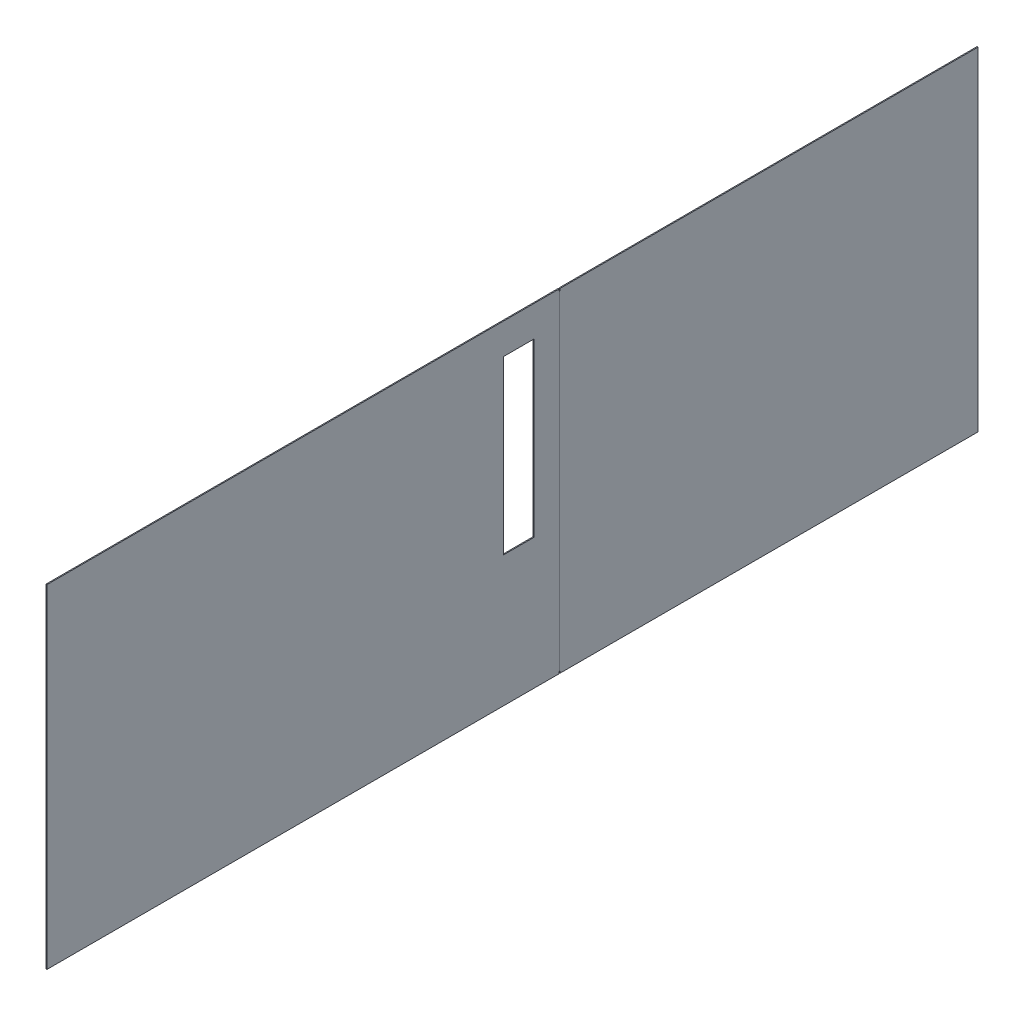
ISO-10303-21;
HEADER;
FILE_DESCRIPTION(('STEP AP214'),'2;1');
FILE_NAME('part.step','',(''),(''),'','','');
FILE_SCHEMA(('AUTOMOTIVE_DESIGN { 1 0 10303 214 1 1 1 1 }'));
ENDSEC;
DATA;
#1=APPLICATION_CONTEXT('core data for automotive mechanical design processes');
#2=APPLICATION_PROTOCOL_DEFINITION('international standard','automotive_design',2000,#1);
#3=PRODUCT_CONTEXT('',#1,'mechanical');
#4=PRODUCT('Part','Part','',(#3));
#5=PRODUCT_RELATED_PRODUCT_CATEGORY('part','',(#4));
#6=PRODUCT_DEFINITION_FORMATION('','',#4);
#7=PRODUCT_DEFINITION_CONTEXT('part definition',#1,'design');
#8=PRODUCT_DEFINITION('design','',#6,#7);
#9=PRODUCT_DEFINITION_SHAPE('','',#8);
#10=(LENGTH_UNIT() NAMED_UNIT(*) SI_UNIT(.MILLI.,.METRE.));
#11=(NAMED_UNIT(*) PLANE_ANGLE_UNIT() SI_UNIT($,.RADIAN.));
#12=(NAMED_UNIT(*) SI_UNIT($,.STERADIAN.) SOLID_ANGLE_UNIT());
#13=UNCERTAINTY_MEASURE_WITH_UNIT(LENGTH_MEASURE(1.E-05),#10,'distance_accuracy_value','');
#14=(GEOMETRIC_REPRESENTATION_CONTEXT(3) GLOBAL_UNCERTAINTY_ASSIGNED_CONTEXT((#13)) GLOBAL_UNIT_ASSIGNED_CONTEXT((#10,
#11,#12)) REPRESENTATION_CONTEXT('',''));
#15=CARTESIAN_POINT('',(0.,0.,0.));
#16=DIRECTION('',(0.,0.,1.));
#17=DIRECTION('',(1.,0.,0.));
#18=AXIS2_PLACEMENT_3D('',#15,#16,#17);
#19=CARTESIAN_POINT('',(1.9,650.,0.117101314961448));
#20=DIRECTION('',(-1.,0.,0.));
#21=DIRECTION('',(0.,0.,1.));
#22=AXIS2_PLACEMENT_3D('',#19,#20,#21);
#23=PLANE('',#22);
#24=DIRECTION('',(0.,0.,-1.));
#25=VECTOR('',#24,1.);
#26=CARTESIAN_POINT('',(1.9,650.,0.117101314961448));
#27=LINE('',#26,#25);
#28=CARTESIAN_POINT('',(1.90000000000003,650.,-0.691449342519362));
#29=VERTEX_POINT('',#28);
#30=CARTESIAN_POINT('',(1.89999999999342,650.,-816.032394794667));
#31=VERTEX_POINT('',#30);
#32=EDGE_CURVE('E229',#29,#31,#27,.T.);
#33=ORIENTED_EDGE('',*,*,#32,.F.);
#34=DIRECTION('',(0.,-1.,0.));
#35=VECTOR('',#34,1.);
#36=CARTESIAN_POINT('',(1.90000000000003,0.,-0.69144934251949));
#37=LINE('',#36,#35);
#38=CARTESIAN_POINT('',(1.90000000000003,646.7,-0.691449342519363));
#39=VERTEX_POINT('',#38);
#40=EDGE_CURVE('E210',#29,#39,#37,.T.);
#41=ORIENTED_EDGE('',*,*,#40,.T.);
#42=CARTESIAN_POINT('',(1.90000000000003,646.7,0.00855065748047966));
#43=DIRECTION('',(-1.,0.,0.));
#44=DIRECTION('',(0.,0.,1.));
#45=AXIS2_PLACEMENT_3D('',#42,#43,#44);
#46=CIRCLE('',#45,0.699999999999883);
#47=CARTESIAN_POINT('',(1.90000000000003,646.002054129574,-0.0450362994651993));
#48=VERTEX_POINT('',#47);
#49=EDGE_CURVE('E220',#39,#48,#46,.T.);
#50=ORIENTED_EDGE('',*,*,#49,.T.);
#51=DIRECTION('',(0.,-1.,0.));
#52=VECTOR('',#51,1.);
#53=CARTESIAN_POINT('',(1.9,650.,-0.0450362994651925));
#54=LINE('',#53,#52);
#55=CARTESIAN_POINT('',(1.90000000000003,3.99794587042642,-0.0450362994651924));
#56=VERTEX_POINT('',#55);
#57=EDGE_CURVE('E383',#48,#56,#54,.T.);
#58=ORIENTED_EDGE('',*,*,#57,.T.);
#59=CARTESIAN_POINT('',(1.90000000000003,3.3,0.00855065748055846));
#60=DIRECTION('',(-1.,0.,0.));
#61=DIRECTION('',(0.,0.,1.));
#62=AXIS2_PLACEMENT_3D('',#59,#60,#61);
#63=CIRCLE('',#62,0.7);
#64=CARTESIAN_POINT('',(1.90000000000003,3.3,-0.691449342519442));
#65=VERTEX_POINT('',#64);
#66=EDGE_CURVE('E262',#65,#56,#63,.F.);
#67=ORIENTED_EDGE('',*,*,#66,.F.);
#68=DIRECTION('',(0.,1.,0.));
#69=VECTOR('',#68,1.);
#70=CARTESIAN_POINT('',(1.90000000000003,0.,-0.691449342519442));
#71=LINE('',#70,#69);
#72=CARTESIAN_POINT('',(1.90000000000003,0.,-0.691449342519442));
#73=VERTEX_POINT('',#72);
#74=EDGE_CURVE('E264',#73,#65,#71,.T.);
#75=ORIENTED_EDGE('',*,*,#74,.F.);
#76=DIRECTION('',(0.,0.,-1.));
#77=VECTOR('',#76,1.);
#78=CARTESIAN_POINT('',(1.9,0.,0.117101314961448));
#79=LINE('',#78,#77);
#80=CARTESIAN_POINT('',(1.89999999999342,0.,-816.032394794667));
#81=VERTEX_POINT('',#80);
#82=EDGE_CURVE('E305',#73,#81,#79,.T.);
#83=ORIENTED_EDGE('',*,*,#82,.T.);
#84=DIRECTION('',(0.,-1.,0.));
#85=VECTOR('',#84,1.);
#86=CARTESIAN_POINT('',(1.89999999999342,650.,-816.032394794667));
#87=LINE('',#86,#85);
#88=EDGE_CURVE('E377',#31,#81,#87,.T.);
#89=ORIENTED_EDGE('',*,*,#88,.F.);
#90=EDGE_LOOP('',(#33,#41,#50,#58,#67,#75,#83,#89));
#91=FACE_BOUND('',#90,.T.);
#92=ADVANCED_FACE('F45',(#91),#23,.F.);
#93=CARTESIAN_POINT('',(0.,650.,0.117101314961463));
#94=DIRECTION('',(-1.,0.,0.));
#95=DIRECTION('',(0.,0.,1.));
#96=AXIS2_PLACEMENT_3D('',#93,#94,#95);
#97=PLANE('',#96);
#98=DIRECTION('',(0.,-1.,0.));
#99=VECTOR('',#98,1.);
#100=CARTESIAN_POINT('',(0.,0.,-0.69144934251949));
#101=LINE('',#100,#99);
#102=CARTESIAN_POINT('',(0.,650.,-0.691449342519362));
#103=VERTEX_POINT('',#102);
#104=CARTESIAN_POINT('',(0.,646.7,-0.691449342519363));
#105=VERTEX_POINT('',#104);
#106=EDGE_CURVE('E213',#103,#105,#101,.T.);
#107=ORIENTED_EDGE('',*,*,#106,.F.);
#108=DIRECTION('',(0.,0.,-1.));
#109=VECTOR('',#108,1.);
#110=CARTESIAN_POINT('',(0.,650.,0.117101314961463));
#111=LINE('',#110,#109);
#112=CARTESIAN_POINT('',(-6.57676360203349E-12,650.,-816.032394794667));
#113=VERTEX_POINT('',#112);
#114=EDGE_CURVE('E367',#103,#113,#111,.T.);
#115=ORIENTED_EDGE('',*,*,#114,.T.);
#116=DIRECTION('',(0.,-1.,0.));
#117=VECTOR('',#116,1.);
#118=CARTESIAN_POINT('',(-6.57676360203349E-12,650.,-816.032394794667));
#119=LINE('',#118,#117);
#120=CARTESIAN_POINT('',(-6.57676360203349E-12,0.,-816.032394794667));
#121=VERTEX_POINT('',#120);
#122=EDGE_CURVE('E369',#113,#121,#119,.T.);
#123=ORIENTED_EDGE('',*,*,#122,.T.);
#124=DIRECTION('',(0.,0.,-1.));
#125=VECTOR('',#124,1.);
#126=CARTESIAN_POINT('',(0.,0.,0.117101314961463));
#127=LINE('',#126,#125);
#128=CARTESIAN_POINT('',(0.,0.,-0.691449342519442));
#129=VERTEX_POINT('',#128);
#130=EDGE_CURVE('E364',#129,#121,#127,.T.);
#131=ORIENTED_EDGE('',*,*,#130,.F.);
#132=DIRECTION('',(0.,1.,0.));
#133=VECTOR('',#132,1.);
#134=CARTESIAN_POINT('',(0.,0.,-0.691449342519442));
#135=LINE('',#134,#133);
#136=CARTESIAN_POINT('',(0.,3.3,-0.691449342519442));
#137=VERTEX_POINT('',#136);
#138=EDGE_CURVE('E279',#129,#137,#135,.T.);
#139=ORIENTED_EDGE('',*,*,#138,.T.);
#140=CARTESIAN_POINT('',(0.,3.3,0.00855065748055846));
#141=DIRECTION('',(-1.,0.,0.));
#142=DIRECTION('',(0.,0.,1.));
#143=AXIS2_PLACEMENT_3D('',#140,#141,#142);
#144=CIRCLE('',#143,0.7);
#145=CARTESIAN_POINT('',(0.,3.99794587042642,-0.045036299465177));
#146=VERTEX_POINT('',#145);
#147=EDGE_CURVE('E276',#137,#146,#144,.F.);
#148=ORIENTED_EDGE('',*,*,#147,.T.);
#149=DIRECTION('',(0.,-1.,0.));
#150=VECTOR('',#149,1.);
#151=CARTESIAN_POINT('',(0.,650.,-0.045036299465177));
#152=LINE('',#151,#150);
#153=CARTESIAN_POINT('',(0.,646.002054129574,-0.045036299465184));
#154=VERTEX_POINT('',#153);
#155=EDGE_CURVE('E380',#154,#146,#152,.T.);
#156=ORIENTED_EDGE('',*,*,#155,.F.);
#157=CARTESIAN_POINT('',(0.,646.7,0.00855065748047966));
#158=DIRECTION('',(-1.,0.,0.));
#159=DIRECTION('',(0.,0.,1.));
#160=AXIS2_PLACEMENT_3D('',#157,#158,#159);
#161=CIRCLE('',#160,0.699999999999883);
#162=EDGE_CURVE('E243',#105,#154,#161,.T.);
#163=ORIENTED_EDGE('',*,*,#162,.F.);
#164=EDGE_LOOP('',(#107,#115,#123,#131,#139,#148,#156,#163));
#165=FACE_BOUND('',#164,.T.);
#166=ADVANCED_FACE('F408',(#165),#97,.T.);
#167=CARTESIAN_POINT('',(2.63659999999999,0.,-0.0450362994651984));
#168=DIRECTION('',(0.,1.,0.));
#169=DIRECTION('',(0.992465233221436,0.,-0.122526572002654));
#170=AXIS2_PLACEMENT_3D('',#167,#168,#169);
#171=PLANE('',#170);
#172=DIRECTION('',(-1.,0.,0.));
#173=VECTOR('',#172,1.);
#174=CARTESIAN_POINT('',(1.90000000000003,0.,-0.691449342519442));
#175=LINE('',#174,#173);
#176=EDGE_CURVE('E298',#73,#129,#175,.T.);
#177=ORIENTED_EDGE('',*,*,#176,.T.);
#178=ORIENTED_EDGE('',*,*,#130,.T.);
#179=DIRECTION('',(1.,0.,-1.61259894326804E-13));
#180=VECTOR('',#179,1.);
#181=CARTESIAN_POINT('',(-6.57676360203349E-12,0.,-816.032394794667));
#182=LINE('',#181,#180);
#183=EDGE_CURVE('E371',#121,#81,#182,.T.);
#184=ORIENTED_EDGE('',*,*,#183,.T.);
#185=ORIENTED_EDGE('',*,*,#82,.F.);
#186=EDGE_LOOP('',(#177,#178,#184,#185));
#187=FACE_BOUND('',#186,.T.);
#188=ADVANCED_FACE('F406',(#187),#171,.F.);
#189=CARTESIAN_POINT('',(0.,650.,1000.));
#190=DIRECTION('',(-1.,0.,0.));
#191=DIRECTION('',(0.,0.,1.));
#192=AXIS2_PLACEMENT_3D('',#189,#190,#191);
#193=PLANE('',#192);
#194=DIRECTION('',(0.,1.,0.));
#195=VECTOR('',#194,1.);
#196=CARTESIAN_POINT('',(0.,590.,110.));
#197=LINE('',#196,#195);
#198=CARTESIAN_POINT('',(0.,255.,110.));
#199=VERTEX_POINT('',#198);
#200=CARTESIAN_POINT('',(0.,590.,110.));
#201=VERTEX_POINT('',#200);
#202=EDGE_CURVE('E335',#199,#201,#197,.T.);
#203=ORIENTED_EDGE('',*,*,#202,.F.);
#204=DIRECTION('',(0.,0.,1.));
#205=VECTOR('',#204,1.);
#206=CARTESIAN_POINT('',(0.,255.,50.));
#207=LINE('',#206,#205);
#208=CARTESIAN_POINT('',(0.,255.,50.));
#209=VERTEX_POINT('',#208);
#210=EDGE_CURVE('E339',#209,#199,#207,.T.);
#211=ORIENTED_EDGE('',*,*,#210,.F.);
#212=DIRECTION('',(0.,-1.,0.));
#213=VECTOR('',#212,1.);
#214=CARTESIAN_POINT('',(0.,590.,50.));
#215=LINE('',#214,#213);
#216=CARTESIAN_POINT('',(0.,590.,50.));
#217=VERTEX_POINT('',#216);
#218=EDGE_CURVE('E344',#217,#209,#215,.T.);
#219=ORIENTED_EDGE('',*,*,#218,.F.);
#220=DIRECTION('',(0.,0.,-1.));
#221=VECTOR('',#220,1.);
#222=CARTESIAN_POINT('',(0.,590.,50.));
#223=LINE('',#222,#221);
#224=EDGE_CURVE('E349',#201,#217,#223,.T.);
#225=ORIENTED_EDGE('',*,*,#224,.F.);
#226=EDGE_LOOP('',(#203,#211,#219,#225));
#227=FACE_BOUND('',#226,.T.);
#228=DIRECTION('',(0.,0.,-1.));
#229=VECTOR('',#228,1.);
#230=CARTESIAN_POINT('',(0.,650.,1000.));
#231=LINE('',#230,#229);
#232=CARTESIAN_POINT('',(0.,650.,1000.));
#233=VERTEX_POINT('',#232);
#234=CARTESIAN_POINT('',(0.,650.,0.808550657480479));
#235=VERTEX_POINT('',#234);
#236=EDGE_CURVE('E332',#233,#235,#231,.T.);
#237=ORIENTED_EDGE('',*,*,#236,.T.);
#238=DIRECTION('',(0.,-1.,0.));
#239=VECTOR('',#238,1.);
#240=CARTESIAN_POINT('',(0.,0.,0.808550657480607));
#241=LINE('',#240,#239);
#242=CARTESIAN_POINT('',(0.,646.7,0.808550657480479));
#243=VERTEX_POINT('',#242);
#244=EDGE_CURVE('E230',#235,#243,#241,.T.);
#245=ORIENTED_EDGE('',*,*,#244,.T.);
#246=CARTESIAN_POINT('',(0.,646.7,0.108550657480479));
#247=DIRECTION('',(-1.,0.,0.));
#248=DIRECTION('',(0.,0.,1.));
#249=AXIS2_PLACEMENT_3D('',#246,#247,#248);
#250=CIRCLE('',#249,0.699999999999962);
#251=CARTESIAN_POINT('',(0.,646.002054129574,0.162137614426295));
#252=VERTEX_POINT('',#251);
#253=EDGE_CURVE('E233',#243,#252,#250,.F.);
#254=ORIENTED_EDGE('',*,*,#253,.T.);
#255=DIRECTION('',(0.,-1.,0.));
#256=VECTOR('',#255,1.);
#257=CARTESIAN_POINT('',(0.,650.,0.162137614426294));
#258=LINE('',#257,#256);
#259=CARTESIAN_POINT('',(0.,3.99794587042642,0.162137614426294));
#260=VERTEX_POINT('',#259);
#261=EDGE_CURVE('E329',#252,#260,#258,.T.);
#262=ORIENTED_EDGE('',*,*,#261,.T.);
#263=CARTESIAN_POINT('',(0.,3.3,0.108550657480558));
#264=DIRECTION('',(-1.,0.,0.));
#265=DIRECTION('',(0.,0.,1.));
#266=AXIS2_PLACEMENT_3D('',#263,#264,#265);
#267=CIRCLE('',#266,0.7);
#268=CARTESIAN_POINT('',(0.,3.3,0.808550657480558));
#269=VERTEX_POINT('',#268);
#270=EDGE_CURVE('E287',#269,#260,#267,.T.);
#271=ORIENTED_EDGE('',*,*,#270,.F.);
#272=DIRECTION('',(0.,1.,0.));
#273=VECTOR('',#272,1.);
#274=CARTESIAN_POINT('',(0.,0.,0.808550657480558));
#275=LINE('',#274,#273);
#276=CARTESIAN_POINT('',(0.,0.,0.808550657480558));
#277=VERTEX_POINT('',#276);
#278=EDGE_CURVE('E283',#277,#269,#275,.T.);
#279=ORIENTED_EDGE('',*,*,#278,.F.);
#280=DIRECTION('',(0.,0.,-1.));
#281=VECTOR('',#280,1.);
#282=CARTESIAN_POINT('',(0.,0.,1000.));
#283=LINE('',#282,#281);
#284=CARTESIAN_POINT('',(0.,0.,1000.));
#285=VERTEX_POINT('',#284);
#286=EDGE_CURVE('E326',#285,#277,#283,.T.);
#287=ORIENTED_EDGE('',*,*,#286,.F.);
#288=DIRECTION('',(0.,-1.,0.));
#289=VECTOR('',#288,1.);
#290=CARTESIAN_POINT('',(0.,650.,1000.));
#291=LINE('',#290,#289);
#292=EDGE_CURVE('E355',#233,#285,#291,.T.);
#293=ORIENTED_EDGE('',*,*,#292,.F.);
#294=EDGE_LOOP('',(#237,#245,#254,#262,#271,#279,#287,#293));
#295=FACE_BOUND('',#294,.T.);
#296=ADVANCED_FACE('F441',(#227,#295),#193,.T.);
#297=CARTESIAN_POINT('',(1.9,650.,1000.));
#298=DIRECTION('',(-1.,0.,0.));
#299=DIRECTION('',(0.,0.,1.));
#300=AXIS2_PLACEMENT_3D('',#297,#298,#299);
#301=PLANE('',#300);
#302=DIRECTION('',(0.,0.,1.));
#303=VECTOR('',#302,1.);
#304=CARTESIAN_POINT('',(1.9,254.999999999999,1000.));
#305=LINE('',#304,#303);
#306=CARTESIAN_POINT('',(1.90000000000003,255.,50.));
#307=VERTEX_POINT('',#306);
#308=CARTESIAN_POINT('',(1.90000000000003,255.,110.));
#309=VERTEX_POINT('',#308);
#310=EDGE_CURVE('E320',#307,#309,#305,.T.);
#311=ORIENTED_EDGE('',*,*,#310,.T.);
#312=DIRECTION('',(0.,1.,0.));
#313=VECTOR('',#312,1.);
#314=CARTESIAN_POINT('',(1.9,650.,110.));
#315=LINE('',#314,#313);
#316=CARTESIAN_POINT('',(1.90000000000003,590.,110.));
#317=VERTEX_POINT('',#316);
#318=EDGE_CURVE('E317',#309,#317,#315,.T.);
#319=ORIENTED_EDGE('',*,*,#318,.T.);
#320=DIRECTION('',(0.,0.,-1.));
#321=VECTOR('',#320,1.);
#322=CARTESIAN_POINT('',(1.9,590.,1000.));
#323=LINE('',#322,#321);
#324=CARTESIAN_POINT('',(1.9,590.,50.));
#325=VERTEX_POINT('',#324);
#326=EDGE_CURVE('E314',#317,#325,#323,.T.);
#327=ORIENTED_EDGE('',*,*,#326,.T.);
#328=DIRECTION('',(0.,-1.,0.));
#329=VECTOR('',#328,1.);
#330=CARTESIAN_POINT('',(1.9,650.,49.9999999999999));
#331=LINE('',#330,#329);
#332=EDGE_CURVE('E311',#325,#307,#331,.T.);
#333=ORIENTED_EDGE('',*,*,#332,.T.);
#334=EDGE_LOOP('',(#311,#319,#327,#333));
#335=FACE_BOUND('',#334,.T.);
#336=DIRECTION('',(0.,-1.,0.));
#337=VECTOR('',#336,1.);
#338=CARTESIAN_POINT('',(1.90000000000003,0.,0.808550657480607));
#339=LINE('',#338,#337);
#340=CARTESIAN_POINT('',(1.90000000000003,650.,0.808550657480479));
#341=VERTEX_POINT('',#340);
#342=CARTESIAN_POINT('',(1.90000000000003,646.7,0.808550657480479));
#343=VERTEX_POINT('',#342);
#344=EDGE_CURVE('E217',#341,#343,#339,.T.);
#345=ORIENTED_EDGE('',*,*,#344,.F.);
#346=DIRECTION('',(0.,0.,-1.));
#347=VECTOR('',#346,1.);
#348=CARTESIAN_POINT('',(1.9,650.,1000.));
#349=LINE('',#348,#347);
#350=CARTESIAN_POINT('',(1.9,650.,1000.));
#351=VERTEX_POINT('',#350);
#352=EDGE_CURVE('E302',#351,#341,#349,.T.);
#353=ORIENTED_EDGE('',*,*,#352,.F.);
#354=DIRECTION('',(0.,-1.,0.));
#355=VECTOR('',#354,1.);
#356=CARTESIAN_POINT('',(1.9,650.,1000.));
#357=LINE('',#356,#355);
#358=CARTESIAN_POINT('',(1.9,0.,1000.));
#359=VERTEX_POINT('',#358);
#360=EDGE_CURVE('E306',#351,#359,#357,.T.);
#361=ORIENTED_EDGE('',*,*,#360,.T.);
#362=DIRECTION('',(0.,0.,-1.));
#363=VECTOR('',#362,1.);
#364=CARTESIAN_POINT('',(1.9,0.,1000.));
#365=LINE('',#364,#363);
#366=CARTESIAN_POINT('',(1.90000000000003,0.,0.808550657480558));
#367=VERTEX_POINT('',#366);
#368=EDGE_CURVE('E308',#359,#367,#365,.T.);
#369=ORIENTED_EDGE('',*,*,#368,.T.);
#370=DIRECTION('',(0.,1.,0.));
#371=VECTOR('',#370,1.);
#372=CARTESIAN_POINT('',(1.90000000000003,0.,0.808550657480558));
#373=LINE('',#372,#371);
#374=CARTESIAN_POINT('',(1.90000000000003,3.3,0.808550657480558));
#375=VERTEX_POINT('',#374);
#376=EDGE_CURVE('E267',#367,#375,#373,.T.);
#377=ORIENTED_EDGE('',*,*,#376,.T.);
#378=CARTESIAN_POINT('',(1.90000000000003,3.3,0.108550657480558));
#379=DIRECTION('',(-1.,0.,0.));
#380=DIRECTION('',(0.,0.,1.));
#381=AXIS2_PLACEMENT_3D('',#378,#379,#380);
#382=CIRCLE('',#381,0.7);
#383=CARTESIAN_POINT('',(1.90000000000003,3.99794587042642,0.162137614426279));
#384=VERTEX_POINT('',#383);
#385=EDGE_CURVE('E270',#375,#384,#382,.T.);
#386=ORIENTED_EDGE('',*,*,#385,.T.);
#387=DIRECTION('',(0.,-1.,0.));
#388=VECTOR('',#387,1.);
#389=CARTESIAN_POINT('',(1.90000000000001,650.,0.162137614426279));
#390=LINE('',#389,#388);
#391=CARTESIAN_POINT('',(1.90000000000003,646.002054129574,0.16213761442628));
#392=VERTEX_POINT('',#391);
#393=EDGE_CURVE('E253',#392,#384,#390,.T.);
#394=ORIENTED_EDGE('',*,*,#393,.F.);
#395=CARTESIAN_POINT('',(1.90000000000003,646.7,0.108550657480479));
#396=DIRECTION('',(-1.,0.,0.));
#397=DIRECTION('',(0.,0.,1.));
#398=AXIS2_PLACEMENT_3D('',#395,#396,#397);
#399=CIRCLE('',#398,0.699999999999962);
#400=EDGE_CURVE('E237',#343,#392,#399,.F.);
#401=ORIENTED_EDGE('',*,*,#400,.F.);
#402=EDGE_LOOP('',(#345,#353,#361,#369,#377,#386,#394,#401));
#403=FACE_BOUND('',#402,.T.);
#404=ADVANCED_FACE('F433',(#335,#403),#301,.F.);
#405=CARTESIAN_POINT('',(2.63660000000001,650.,0.162137614426273));
#406=DIRECTION('',(0.,1.,0.));
#407=DIRECTION('',(1.,0.,0.));
#408=AXIS2_PLACEMENT_3D('',#405,#406,#407);
#409=PLANE('',#408);
#410=ORIENTED_EDGE('',*,*,#352,.T.);
#411=DIRECTION('',(-1.,0.,0.));
#412=VECTOR('',#411,1.);
#413=CARTESIAN_POINT('',(1.90000000000003,650.,0.808550657480479));
#414=LINE('',#413,#412);
#415=EDGE_CURVE('E254',#341,#235,#414,.T.);
#416=ORIENTED_EDGE('',*,*,#415,.T.);
#417=ORIENTED_EDGE('',*,*,#236,.F.);
#418=DIRECTION('',(-1.,0.,0.));
#419=VECTOR('',#418,1.);
#420=CARTESIAN_POINT('',(1.9,650.,1000.));
#421=LINE('',#420,#419);
#422=EDGE_CURVE('E357',#351,#233,#421,.T.);
#423=ORIENTED_EDGE('',*,*,#422,.F.);
#424=EDGE_LOOP('',(#410,#416,#417,#423));
#425=FACE_BOUND('',#424,.T.);
#426=ADVANCED_FACE('F448',(#425),#409,.T.);
#427=CARTESIAN_POINT('',(0.,325.,0.0585506574805586));
#428=DIRECTION('',(-1.,0.,0.));
#429=DIRECTION('',(0.,0.,1.));
#430=AXIS2_PLACEMENT_3D('',#427,#428,#429);
#431=PLANE('',#430);
#432=ORIENTED_EDGE('',*,*,#261,.F.);
#433=CARTESIAN_POINT('',(0.,646.,0.10855065748048));
#434=VERTEX_POINT('',#433);
#435=EDGE_CURVE('E248',#252,#434,#250,.F.);
#436=ORIENTED_EDGE('',*,*,#435,.T.);
#437=DIRECTION('',(0.,0.,1.));
#438=VECTOR('',#437,1.);
#439=CARTESIAN_POINT('',(0.,646.,0.));
#440=LINE('',#439,#438);
#441=CARTESIAN_POINT('',(0.,646.,0.00855065748063708));
#442=VERTEX_POINT('',#441);
#443=EDGE_CURVE('E245',#442,#434,#440,.T.);
#444=ORIENTED_EDGE('',*,*,#443,.F.);
#445=EDGE_CURVE('E241',#154,#442,#161,.T.);
#446=ORIENTED_EDGE('',*,*,#445,.F.);
#447=ORIENTED_EDGE('',*,*,#155,.T.);
#448=CARTESIAN_POINT('',(0.,4.,0.00855065748055846));
#449=VERTEX_POINT('',#448);
#450=EDGE_CURVE('E280',#146,#449,#144,.F.);
#451=ORIENTED_EDGE('',*,*,#450,.T.);
#452=DIRECTION('',(0.,0.,1.));
#453=VECTOR('',#452,1.);
#454=CARTESIAN_POINT('',(0.,4.,0.));
#455=LINE('',#454,#453);
#456=CARTESIAN_POINT('',(0.,4.,0.108550657480558));
#457=VERTEX_POINT('',#456);
#458=EDGE_CURVE('E265',#449,#457,#455,.T.);
#459=ORIENTED_EDGE('',*,*,#458,.T.);
#460=EDGE_CURVE('E286',#260,#457,#267,.T.);
#461=ORIENTED_EDGE('',*,*,#460,.F.);
#462=EDGE_LOOP('',(#432,#436,#444,#446,#447,#451,#459,#461));
#463=FACE_BOUND('',#462,.T.);
#464=ADVANCED_FACE('F421',(#463),#431,.T.);
#465=CARTESIAN_POINT('',(1.9,325.,0.0585506574805586));
#466=DIRECTION('',(-1.,0.,0.));
#467=DIRECTION('',(0.,0.,1.));
#468=AXIS2_PLACEMENT_3D('',#465,#466,#467);
#469=PLANE('',#468);
#470=CARTESIAN_POINT('',(1.9,646.7,0.108550657480479));
#471=DIRECTION('',(-1.,0.,0.));
#472=DIRECTION('',(0.,0.,1.));
#473=AXIS2_PLACEMENT_3D('',#470,#471,#472);
#474=CIRCLE('',#473,0.699999999999962);
#475=CARTESIAN_POINT('',(1.90000000000003,646.,0.10855065748048));
#476=VERTEX_POINT('',#475);
#477=EDGE_CURVE('E11',#392,#476,#474,.F.);
#478=ORIENTED_EDGE('',*,*,#477,.F.);
#479=ORIENTED_EDGE('',*,*,#393,.T.);
#480=CARTESIAN_POINT('',(1.9,3.3,0.108550657480558));
#481=DIRECTION('',(-1.,0.,0.));
#482=DIRECTION('',(0.,0.,1.));
#483=AXIS2_PLACEMENT_3D('',#480,#481,#482);
#484=CIRCLE('',#483,0.7);
#485=CARTESIAN_POINT('',(1.9,4.,0.108550657480558));
#486=VERTEX_POINT('',#485);
#487=EDGE_CURVE('E385',#384,#486,#484,.T.);
#488=ORIENTED_EDGE('',*,*,#487,.T.);
#489=DIRECTION('',(0.,0.,1.));
#490=VECTOR('',#489,1.);
#491=CARTESIAN_POINT('',(1.90000000000003,4.,0.));
#492=LINE('',#491,#490);
#493=CARTESIAN_POINT('',(1.90000000000003,4.,0.00855065748055846));
#494=VERTEX_POINT('',#493);
#495=EDGE_CURVE('E273',#494,#486,#492,.T.);
#496=ORIENTED_EDGE('',*,*,#495,.F.);
#497=CARTESIAN_POINT('',(1.9,3.3,0.00855065748055846));
#498=DIRECTION('',(-1.,0.,0.));
#499=DIRECTION('',(0.,0.,1.));
#500=AXIS2_PLACEMENT_3D('',#497,#498,#499);
#501=CIRCLE('',#500,0.7);
#502=EDGE_CURVE('E388',#56,#494,#501,.F.);
#503=ORIENTED_EDGE('',*,*,#502,.F.);
#504=ORIENTED_EDGE('',*,*,#57,.F.);
#505=CARTESIAN_POINT('',(1.9,646.7,0.00855065748047966));
#506=DIRECTION('',(-1.,0.,0.));
#507=DIRECTION('',(0.,0.,1.));
#508=AXIS2_PLACEMENT_3D('',#505,#506,#507);
#509=CIRCLE('',#508,0.699999999999883);
#510=CARTESIAN_POINT('',(1.9,646.,0.00855065748063708));
#511=VERTEX_POINT('',#510);
#512=EDGE_CURVE('E53',#48,#511,#509,.T.);
#513=ORIENTED_EDGE('',*,*,#512,.T.);
#514=DIRECTION('',(0.,0.,1.));
#515=VECTOR('',#514,1.);
#516=CARTESIAN_POINT('',(1.90000000000003,646.,0.));
#517=LINE('',#516,#515);
#518=EDGE_CURVE('E60',#511,#476,#517,.T.);
#519=ORIENTED_EDGE('',*,*,#518,.T.);
#520=EDGE_LOOP('',(#478,#479,#488,#496,#503,#504,#513,#519));
#521=FACE_BOUND('',#520,.T.);
#522=ADVANCED_FACE('F391',(#521),#469,.F.);
#523=CARTESIAN_POINT('',(1.90555010920908,650.,0.0452167734719627));
#524=DIRECTION('',(0.,1.,0.));
#525=DIRECTION('',(0.122526572002654,0.,0.992465233221436));
#526=AXIS2_PLACEMENT_3D('',#523,#524,#525);
#527=PLANE('',#526);
#528=DIRECTION('',(-1.,0.,0.));
#529=VECTOR('',#528,1.);
#530=CARTESIAN_POINT('',(1.90000000000003,650.,-0.691449342519362));
#531=LINE('',#530,#529);
#532=EDGE_CURVE('E251',#29,#103,#531,.T.);
#533=ORIENTED_EDGE('',*,*,#532,.F.);
#534=ORIENTED_EDGE('',*,*,#32,.T.);
#535=DIRECTION('',(1.,0.,-1.61259894326804E-13));
#536=VECTOR('',#535,1.);
#537=CARTESIAN_POINT('',(-6.57676360203349E-12,650.,-816.032394794667));
#538=LINE('',#537,#536);
#539=EDGE_CURVE('E363',#113,#31,#538,.T.);
#540=ORIENTED_EDGE('',*,*,#539,.F.);
#541=ORIENTED_EDGE('',*,*,#114,.F.);
#542=EDGE_LOOP('',(#533,#534,#540,#541));
#543=FACE_BOUND('',#542,.T.);
#544=ADVANCED_FACE('F47',(#543),#527,.T.);
#545=CARTESIAN_POINT('',(-6.57676360203349E-12,650.,-816.032394794667));
#546=DIRECTION('',(-1.61246016538996E-13,0.,-1.));
#547=DIRECTION('',(-1.,0.,1.61246016538996E-13));
#548=AXIS2_PLACEMENT_3D('',#545,#546,#547);
#549=PLANE('',#548);
#550=ORIENTED_EDGE('',*,*,#183,.F.);
#551=ORIENTED_EDGE('',*,*,#122,.F.);
#552=ORIENTED_EDGE('',*,*,#539,.T.);
#553=ORIENTED_EDGE('',*,*,#88,.T.);
#554=EDGE_LOOP('',(#550,#551,#552,#553));
#555=FACE_BOUND('',#554,.T.);
#556=ADVANCED_FACE('F414',(#555),#549,.T.);
#557=CARTESIAN_POINT('',(1.9,650.,1000.));
#558=DIRECTION('',(0.,0.,1.));
#559=DIRECTION('',(1.,0.,0.));
#560=AXIS2_PLACEMENT_3D('',#557,#558,#559);
#561=PLANE('',#560);
#562=DIRECTION('',(-1.,0.,0.));
#563=VECTOR('',#562,1.);
#564=CARTESIAN_POINT('',(1.9,0.,1000.));
#565=LINE('',#564,#563);
#566=EDGE_CURVE('E323',#359,#285,#565,.T.);
#567=ORIENTED_EDGE('',*,*,#566,.F.);
#568=ORIENTED_EDGE('',*,*,#360,.F.);
#569=ORIENTED_EDGE('',*,*,#422,.T.);
#570=ORIENTED_EDGE('',*,*,#292,.T.);
#571=EDGE_LOOP('',(#567,#568,#569,#570));
#572=FACE_BOUND('',#571,.T.);
#573=ADVANCED_FACE('F452',(#572),#561,.T.);
#574=CARTESIAN_POINT('',(101.885683943121,590.,50.));
#575=DIRECTION('',(0.,1.,0.));
#576=DIRECTION('',(0.,0.,1.));
#577=AXIS2_PLACEMENT_3D('',#574,#575,#576);
#578=PLANE('',#577);
#579=DIRECTION('',(-1.,0.,0.));
#580=VECTOR('',#579,1.);
#581=CARTESIAN_POINT('',(101.885683943121,590.,110.));
#582=LINE('',#581,#580);
#583=EDGE_CURVE('E352',#317,#201,#582,.T.);
#584=ORIENTED_EDGE('',*,*,#583,.T.);
#585=ORIENTED_EDGE('',*,*,#224,.T.);
#586=DIRECTION('',(-1.,0.,0.));
#587=VECTOR('',#586,1.);
#588=CARTESIAN_POINT('',(101.885683943121,590.,50.));
#589=LINE('',#588,#587);
#590=EDGE_CURVE('E347',#325,#217,#589,.T.);
#591=ORIENTED_EDGE('',*,*,#590,.F.);
#592=ORIENTED_EDGE('',*,*,#326,.F.);
#593=EDGE_LOOP('',(#584,#585,#591,#592));
#594=FACE_BOUND('',#593,.T.);
#595=ADVANCED_FACE('F499',(#594),#578,.F.);
#596=CARTESIAN_POINT('',(101.885683943121,590.,50.));
#597=DIRECTION('',(0.,0.,-1.));
#598=DIRECTION('',(0.,1.,0.));
#599=AXIS2_PLACEMENT_3D('',#596,#597,#598);
#600=PLANE('',#599);
#601=ORIENTED_EDGE('',*,*,#590,.T.);
#602=ORIENTED_EDGE('',*,*,#218,.T.);
#603=DIRECTION('',(-1.,0.,0.));
#604=VECTOR('',#603,1.);
#605=CARTESIAN_POINT('',(101.885683943121,255.,50.));
#606=LINE('',#605,#604);
#607=EDGE_CURVE('E342',#307,#209,#606,.T.);
#608=ORIENTED_EDGE('',*,*,#607,.F.);
#609=ORIENTED_EDGE('',*,*,#332,.F.);
#610=EDGE_LOOP('',(#601,#602,#608,#609));
#611=FACE_BOUND('',#610,.T.);
#612=ADVANCED_FACE('F495',(#611),#600,.F.);
#613=CARTESIAN_POINT('',(101.885683943121,255.,50.));
#614=DIRECTION('',(0.,-1.,0.));
#615=DIRECTION('',(0.,0.,-1.));
#616=AXIS2_PLACEMENT_3D('',#613,#614,#615);
#617=PLANE('',#616);
#618=ORIENTED_EDGE('',*,*,#607,.T.);
#619=ORIENTED_EDGE('',*,*,#210,.T.);
#620=DIRECTION('',(-1.,0.,0.));
#621=VECTOR('',#620,1.);
#622=CARTESIAN_POINT('',(101.885683943121,255.,110.));
#623=LINE('',#622,#621);
#624=EDGE_CURVE('E337',#309,#199,#623,.T.);
#625=ORIENTED_EDGE('',*,*,#624,.F.);
#626=ORIENTED_EDGE('',*,*,#310,.F.);
#627=EDGE_LOOP('',(#618,#619,#625,#626));
#628=FACE_BOUND('',#627,.T.);
#629=ADVANCED_FACE('F491',(#628),#617,.F.);
#630=CARTESIAN_POINT('',(101.885683943121,590.,110.));
#631=DIRECTION('',(0.,0.,1.));
#632=DIRECTION('',(0.,-1.,0.));
#633=AXIS2_PLACEMENT_3D('',#630,#631,#632);
#634=PLANE('',#633);
#635=ORIENTED_EDGE('',*,*,#624,.T.);
#636=ORIENTED_EDGE('',*,*,#202,.T.);
#637=ORIENTED_EDGE('',*,*,#583,.F.);
#638=ORIENTED_EDGE('',*,*,#318,.F.);
#639=EDGE_LOOP('',(#635,#636,#637,#638));
#640=FACE_BOUND('',#639,.T.);
#641=ADVANCED_FACE('F486',(#640),#634,.F.);
#642=CARTESIAN_POINT('',(1.90555010920911,0.,0.0718845414891251));
#643=DIRECTION('',(0.,-1.,0.));
#644=DIRECTION('',(0.,0.,-1.));
#645=AXIS2_PLACEMENT_3D('',#642,#643,#644);
#646=PLANE('',#645);
#647=DIRECTION('',(-1.,0.,0.));
#648=VECTOR('',#647,1.);
#649=CARTESIAN_POINT('',(1.90000000000003,0.,0.808550657480558));
#650=LINE('',#649,#648);
#651=EDGE_CURVE('E296',#367,#277,#650,.T.);
#652=ORIENTED_EDGE('',*,*,#651,.F.);
#653=ORIENTED_EDGE('',*,*,#368,.F.);
#654=ORIENTED_EDGE('',*,*,#566,.T.);
#655=ORIENTED_EDGE('',*,*,#286,.T.);
#656=EDGE_LOOP('',(#652,#653,#654,#655));
#657=FACE_BOUND('',#656,.T.);
#658=ADVANCED_FACE('F457',(#657),#646,.T.);
#659=CARTESIAN_POINT('',(1.90000000000003,3.3,0.00855065748055846));
#660=DIRECTION('',(-1.,0.,0.));
#661=DIRECTION('',(0.,0.,1.));
#662=AXIS2_PLACEMENT_3D('',#659,#660,#661);
#663=CYLINDRICAL_SURFACE('',#662,0.7);
#664=ORIENTED_EDGE('',*,*,#147,.F.);
#665=DIRECTION('',(-1.,0.,0.));
#666=VECTOR('',#665,1.);
#667=CARTESIAN_POINT('',(1.90000000000003,3.3,-0.691449342519442));
#668=LINE('',#667,#666);
#669=EDGE_CURVE('E275',#65,#137,#668,.T.);
#670=ORIENTED_EDGE('',*,*,#669,.F.);
#671=ORIENTED_EDGE('',*,*,#66,.T.);
#672=ORIENTED_EDGE('',*,*,#502,.T.);
#673=DIRECTION('',(-1.,0.,0.));
#674=VECTOR('',#673,1.);
#675=CARTESIAN_POINT('',(1.90000000000003,4.,0.00855065748055846));
#676=LINE('',#675,#674);
#677=EDGE_CURVE('E242',#494,#449,#676,.T.);
#678=ORIENTED_EDGE('',*,*,#677,.T.);
#679=ORIENTED_EDGE('',*,*,#450,.F.);
#680=EDGE_LOOP('',(#664,#670,#671,#672,#678,#679));
#681=FACE_BOUND('',#680,.T.);
#682=ADVANCED_FACE('F400',(#681),#663,.F.);
#683=CARTESIAN_POINT('',(1.90000000000003,4.,0.));
#684=DIRECTION('',(0.,-1.,0.));
#685=DIRECTION('',(0.,0.,-1.));
#686=AXIS2_PLACEMENT_3D('',#683,#684,#685);
#687=PLANE('',#686);
#688=ORIENTED_EDGE('',*,*,#458,.F.);
#689=ORIENTED_EDGE('',*,*,#677,.F.);
#690=ORIENTED_EDGE('',*,*,#495,.T.);
#691=DIRECTION('',(-1.,0.,0.));
#692=VECTOR('',#691,1.);
#693=CARTESIAN_POINT('',(1.90000000000003,4.,0.108550657480558));
#694=LINE('',#693,#692);
#695=EDGE_CURVE('E68',#486,#457,#694,.T.);
#696=ORIENTED_EDGE('',*,*,#695,.T.);
#697=EDGE_LOOP('',(#688,#689,#690,#696));
#698=FACE_BOUND('',#697,.T.);
#699=ADVANCED_FACE('F437',(#698),#687,.T.);
#700=CARTESIAN_POINT('',(1.90000000000003,3.3,0.108550657480558));
#701=DIRECTION('',(-1.,0.,0.));
#702=DIRECTION('',(0.,0.,1.));
#703=AXIS2_PLACEMENT_3D('',#700,#701,#702);
#704=CYLINDRICAL_SURFACE('',#703,0.7);
#705=ORIENTED_EDGE('',*,*,#270,.T.);
#706=ORIENTED_EDGE('',*,*,#460,.T.);
#707=ORIENTED_EDGE('',*,*,#695,.F.);
#708=ORIENTED_EDGE('',*,*,#487,.F.);
#709=ORIENTED_EDGE('',*,*,#385,.F.);
#710=DIRECTION('',(-1.,0.,0.));
#711=VECTOR('',#710,1.);
#712=CARTESIAN_POINT('',(1.90000000000003,3.3,0.808550657480558));
#713=LINE('',#712,#711);
#714=EDGE_CURVE('E294',#375,#269,#713,.T.);
#715=ORIENTED_EDGE('',*,*,#714,.T.);
#716=EDGE_LOOP('',(#705,#706,#707,#708,#709,#715));
#717=FACE_BOUND('',#716,.T.);
#718=ADVANCED_FACE('F435',(#717),#704,.F.);
#719=CARTESIAN_POINT('',(1.90000000000003,0.,0.808550657480558));
#720=DIRECTION('',(0.,0.,1.));
#721=DIRECTION('',(0.,-1.,0.));
#722=AXIS2_PLACEMENT_3D('',#719,#720,#721);
#723=PLANE('',#722);
#724=ORIENTED_EDGE('',*,*,#278,.T.);
#725=ORIENTED_EDGE('',*,*,#714,.F.);
#726=ORIENTED_EDGE('',*,*,#376,.F.);
#727=ORIENTED_EDGE('',*,*,#651,.T.);
#728=EDGE_LOOP('',(#724,#725,#726,#727));
#729=FACE_BOUND('',#728,.T.);
#730=ADVANCED_FACE('F459',(#729),#723,.F.);
#731=CARTESIAN_POINT('',(1.90000000000003,0.,-0.691449342519442));
#732=DIRECTION('',(0.,0.,1.));
#733=DIRECTION('',(0.,-1.,0.));
#734=AXIS2_PLACEMENT_3D('',#731,#732,#733);
#735=PLANE('',#734);
#736=ORIENTED_EDGE('',*,*,#138,.F.);
#737=ORIENTED_EDGE('',*,*,#176,.F.);
#738=ORIENTED_EDGE('',*,*,#74,.T.);
#739=ORIENTED_EDGE('',*,*,#669,.T.);
#740=EDGE_LOOP('',(#736,#737,#738,#739));
#741=FACE_BOUND('',#740,.T.);
#742=ADVANCED_FACE('F403',(#741),#735,.T.);
#743=CARTESIAN_POINT('',(1.90000000000003,0.,-0.69144934251949));
#744=DIRECTION('',(0.,0.,-1.));
#745=DIRECTION('',(0.,1.,0.));
#746=AXIS2_PLACEMENT_3D('',#743,#744,#745);
#747=PLANE('',#746);
#748=ORIENTED_EDGE('',*,*,#106,.T.);
#749=DIRECTION('',(-1.,0.,0.));
#750=VECTOR('',#749,1.);
#751=CARTESIAN_POINT('',(1.90000000000003,646.7,-0.691449342519363));
#752=LINE('',#751,#750);
#753=EDGE_CURVE('E206',#39,#105,#752,.T.);
#754=ORIENTED_EDGE('',*,*,#753,.F.);
#755=ORIENTED_EDGE('',*,*,#40,.F.);
#756=ORIENTED_EDGE('',*,*,#532,.T.);
#757=EDGE_LOOP('',(#748,#754,#755,#756));
#758=FACE_BOUND('',#757,.T.);
#759=ADVANCED_FACE('F208',(#758),#747,.F.);
#760=CARTESIAN_POINT('',(1.90000000000003,0.,0.808550657480607));
#761=DIRECTION('',(0.,0.,-1.));
#762=DIRECTION('',(0.,1.,0.));
#763=AXIS2_PLACEMENT_3D('',#760,#761,#762);
#764=PLANE('',#763);
#765=ORIENTED_EDGE('',*,*,#244,.F.);
#766=ORIENTED_EDGE('',*,*,#415,.F.);
#767=ORIENTED_EDGE('',*,*,#344,.T.);
#768=DIRECTION('',(-1.,0.,0.));
#769=VECTOR('',#768,1.);
#770=CARTESIAN_POINT('',(1.90000000000003,646.7,0.808550657480479));
#771=LINE('',#770,#769);
#772=EDGE_CURVE('E257',#343,#243,#771,.T.);
#773=ORIENTED_EDGE('',*,*,#772,.T.);
#774=EDGE_LOOP('',(#765,#766,#767,#773));
#775=FACE_BOUND('',#774,.T.);
#776=ADVANCED_FACE('F444',(#775),#764,.T.);
#777=CARTESIAN_POINT('',(1.90000000000003,646.7,0.108550657480479));
#778=DIRECTION('',(-1.,0.,0.));
#779=DIRECTION('',(0.,0.,1.));
#780=AXIS2_PLACEMENT_3D('',#777,#778,#779);
#781=CYLINDRICAL_SURFACE('',#780,0.699999999999962);
#782=ORIENTED_EDGE('',*,*,#253,.F.);
#783=ORIENTED_EDGE('',*,*,#772,.F.);
#784=ORIENTED_EDGE('',*,*,#400,.T.);
#785=ORIENTED_EDGE('',*,*,#477,.T.);
#786=DIRECTION('',(-1.,0.,0.));
#787=VECTOR('',#786,1.);
#788=CARTESIAN_POINT('',(1.90000000000003,646.,0.10855065748048));
#789=LINE('',#788,#787);
#790=EDGE_CURVE('E259',#476,#434,#789,.T.);
#791=ORIENTED_EDGE('',*,*,#790,.T.);
#792=ORIENTED_EDGE('',*,*,#435,.F.);
#793=EDGE_LOOP('',(#782,#783,#784,#785,#791,#792));
#794=FACE_BOUND('',#793,.T.);
#795=ADVANCED_FACE('F427',(#794),#781,.F.);
#796=CARTESIAN_POINT('',(1.90000000000003,646.,0.));
#797=DIRECTION('',(0.,-1.,0.));
#798=DIRECTION('',(0.,0.,-1.));
#799=AXIS2_PLACEMENT_3D('',#796,#797,#798);
#800=PLANE('',#799);
#801=ORIENTED_EDGE('',*,*,#443,.T.);
#802=ORIENTED_EDGE('',*,*,#790,.F.);
#803=ORIENTED_EDGE('',*,*,#518,.F.);
#804=DIRECTION('',(-1.,0.,0.));
#805=VECTOR('',#804,1.);
#806=CARTESIAN_POINT('',(1.90000000000003,646.,0.00855065748063708));
#807=LINE('',#806,#805);
#808=EDGE_CURVE('E216',#511,#442,#807,.T.);
#809=ORIENTED_EDGE('',*,*,#808,.T.);
#810=EDGE_LOOP('',(#801,#802,#803,#809));
#811=FACE_BOUND('',#810,.T.);
#812=ADVANCED_FACE('F424',(#811),#800,.F.);
#813=CARTESIAN_POINT('',(1.90000000000003,646.7,0.00855065748047966));
#814=DIRECTION('',(-1.,0.,0.));
#815=DIRECTION('',(0.,0.,1.));
#816=AXIS2_PLACEMENT_3D('',#813,#814,#815);
#817=CYLINDRICAL_SURFACE('',#816,0.699999999999883);
#818=ORIENTED_EDGE('',*,*,#162,.T.);
#819=ORIENTED_EDGE('',*,*,#445,.T.);
#820=ORIENTED_EDGE('',*,*,#808,.F.);
#821=ORIENTED_EDGE('',*,*,#512,.F.);
#822=ORIENTED_EDGE('',*,*,#49,.F.);
#823=ORIENTED_EDGE('',*,*,#753,.T.);
#824=EDGE_LOOP('',(#818,#819,#820,#821,#822,#823));
#825=FACE_BOUND('',#824,.T.);
#826=ADVANCED_FACE('F221',(#825),#817,.F.);
#827=CLOSED_SHELL('',(#92,#166,#188,#296,#404,#426,#464,#522,#544,#556,#573,#595,#612,#629,#641,
#658,#682,#699,#718,#730,#742,#759,#776,#795,#812,#826));
#828=MANIFOLD_SOLID_BREP('B2',#827);
#829=ADVANCED_BREP_SHAPE_REPRESENTATION('',(#18,#828),#14);
#830=SHAPE_DEFINITION_REPRESENTATION(#9,#829);
ENDSEC;
END-ISO-10303-21;
